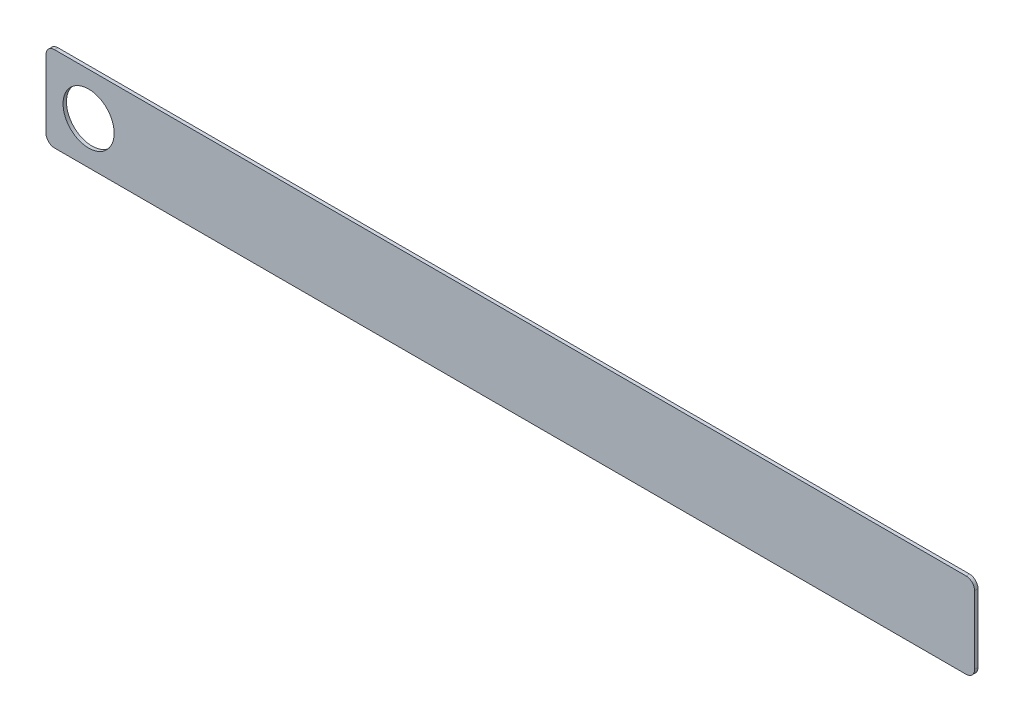
ISO-10303-21;
HEADER;
FILE_DESCRIPTION(('STEP AP214'),'2;1');
FILE_NAME('part.step','',(''),(''),'','','');
FILE_SCHEMA(('AUTOMOTIVE_DESIGN { 1 0 10303 214 1 1 1 1 }'));
ENDSEC;
DATA;
#1=APPLICATION_CONTEXT('core data for automotive mechanical design processes');
#2=APPLICATION_PROTOCOL_DEFINITION('international standard','automotive_design',2000,#1);
#3=PRODUCT_CONTEXT('',#1,'mechanical');
#4=PRODUCT('Part','Part','',(#3));
#5=PRODUCT_RELATED_PRODUCT_CATEGORY('part','',(#4));
#6=PRODUCT_DEFINITION_FORMATION('','',#4);
#7=PRODUCT_DEFINITION_CONTEXT('part definition',#1,'design');
#8=PRODUCT_DEFINITION('design','',#6,#7);
#9=PRODUCT_DEFINITION_SHAPE('','',#8);
#10=(LENGTH_UNIT() NAMED_UNIT(*) SI_UNIT(.MILLI.,.METRE.));
#11=(NAMED_UNIT(*) PLANE_ANGLE_UNIT() SI_UNIT($,.RADIAN.));
#12=(NAMED_UNIT(*) SI_UNIT($,.STERADIAN.) SOLID_ANGLE_UNIT());
#13=UNCERTAINTY_MEASURE_WITH_UNIT(LENGTH_MEASURE(1.E-05),#10,'distance_accuracy_value','');
#14=(GEOMETRIC_REPRESENTATION_CONTEXT(3) GLOBAL_UNCERTAINTY_ASSIGNED_CONTEXT((#13)) GLOBAL_UNIT_ASSIGNED_CONTEXT((#10,
#11,#12)) REPRESENTATION_CONTEXT('',''));
#15=CARTESIAN_POINT('',(0.,0.,0.));
#16=DIRECTION('',(0.,0.,1.));
#17=DIRECTION('',(1.,0.,0.));
#18=AXIS2_PLACEMENT_3D('',#15,#16,#17);
#19=CARTESIAN_POINT('',(18.9228917978101,1.4,0.17));
#20=DIRECTION('',(0.,0.,-1.));
#21=DIRECTION('',(-1.,0.,0.));
#22=AXIS2_PLACEMENT_3D('',#19,#20,#21);
#23=PLANE('',#22);
#24=CARTESIAN_POINT('',(18.9228917978101,1.4,0.17));
#25=DIRECTION('',(0.,0.,1.));
#26=DIRECTION('',(-1.,0.,0.));
#27=AXIS2_PLACEMENT_3D('',#24,#25,#26);
#28=CIRCLE('',#27,0.350000000000003);
#29=CARTESIAN_POINT('',(19.2728917978101,1.4,0.17));
#30=VERTEX_POINT('',#29);
#31=CARTESIAN_POINT('',(18.9228917978101,1.75,0.17));
#32=VERTEX_POINT('',#31);
#33=EDGE_CURVE('E154',#30,#32,#28,.T.);
#34=ORIENTED_EDGE('',*,*,#33,.T.);
#35=DIRECTION('',(-1.,0.,0.));
#36=VECTOR('',#35,1.);
#37=CARTESIAN_POINT('',(-18.5271082021899,1.75,0.17));
#38=LINE('',#37,#36);
#39=CARTESIAN_POINT('',(-18.5271082021899,1.75,0.17));
#40=VERTEX_POINT('',#39);
#41=EDGE_CURVE('E102',#32,#40,#38,.T.);
#42=ORIENTED_EDGE('',*,*,#41,.T.);
#43=CARTESIAN_POINT('',(-18.5271082021899,1.4,0.17));
#44=DIRECTION('',(0.,0.,1.));
#45=DIRECTION('',(1.,0.,0.));
#46=AXIS2_PLACEMENT_3D('',#43,#44,#45);
#47=CIRCLE('',#46,0.349999999999999);
#48=CARTESIAN_POINT('',(-18.8771082021899,1.4,0.17));
#49=VERTEX_POINT('',#48);
#50=EDGE_CURVE('E169',#40,#49,#47,.T.);
#51=ORIENTED_EDGE('',*,*,#50,.T.);
#52=DIRECTION('',(0.,-1.,0.));
#53=VECTOR('',#52,1.);
#54=CARTESIAN_POINT('',(-18.8771082021899,1.4,0.17));
#55=LINE('',#54,#53);
#56=CARTESIAN_POINT('',(-18.8771082021899,-1.4,0.17));
#57=VERTEX_POINT('',#56);
#58=EDGE_CURVE('E182',#49,#57,#55,.T.);
#59=ORIENTED_EDGE('',*,*,#58,.T.);
#60=CARTESIAN_POINT('',(-18.5271082021899,-1.4,0.17));
#61=DIRECTION('',(0.,0.,1.));
#62=DIRECTION('',(1.,0.,0.));
#63=AXIS2_PLACEMENT_3D('',#60,#61,#62);
#64=CIRCLE('',#63,0.349999999999999);
#65=CARTESIAN_POINT('',(-18.5271082021899,-1.75,0.17));
#66=VERTEX_POINT('',#65);
#67=EDGE_CURVE('E121',#57,#66,#64,.T.);
#68=ORIENTED_EDGE('',*,*,#67,.T.);
#69=DIRECTION('',(1.,0.,0.));
#70=VECTOR('',#69,1.);
#71=CARTESIAN_POINT('',(-18.5271082021899,-1.75,0.17));
#72=LINE('',#71,#70);
#73=CARTESIAN_POINT('',(18.9228917978101,-1.75,0.17));
#74=VERTEX_POINT('',#73);
#75=EDGE_CURVE('E115',#66,#74,#72,.T.);
#76=ORIENTED_EDGE('',*,*,#75,.T.);
#77=CARTESIAN_POINT('',(18.9228917978101,-1.4,0.17));
#78=DIRECTION('',(0.,0.,1.));
#79=DIRECTION('',(1.,0.,0.));
#80=AXIS2_PLACEMENT_3D('',#77,#78,#79);
#81=CIRCLE('',#80,0.350000000000003);
#82=CARTESIAN_POINT('',(19.2728917978101,-1.4,0.17));
#83=VERTEX_POINT('',#82);
#84=EDGE_CURVE('E119',#74,#83,#81,.T.);
#85=ORIENTED_EDGE('',*,*,#84,.T.);
#86=DIRECTION('',(0.,1.,0.));
#87=VECTOR('',#86,1.);
#88=CARTESIAN_POINT('',(19.2728917978101,1.4,0.17));
#89=LINE('',#88,#87);
#90=EDGE_CURVE('E59',#83,#30,#89,.T.);
#91=ORIENTED_EDGE('',*,*,#90,.T.);
#92=EDGE_LOOP('',(#34,#42,#51,#59,#68,#76,#85,#91));
#93=FACE_BOUND('',#92,.T.);
#94=CARTESIAN_POINT('',(-17.1271082021899,0.,0.17));
#95=DIRECTION('',(0.,0.,1.));
#96=DIRECTION('',(1.,0.,0.));
#97=AXIS2_PLACEMENT_3D('',#94,#95,#96);
#98=CIRCLE('',#97,1.05);
#99=CARTESIAN_POINT('',(-16.0771082021899,0.,0.17));
#100=VERTEX_POINT('',#99);
#101=EDGE_CURVE('E143',#100,#100,#98,.T.);
#102=ORIENTED_EDGE('',*,*,#101,.F.);
#103=EDGE_LOOP('',(#102));
#104=FACE_BOUND('',#103,.T.);
#105=ADVANCED_FACE('F42',(#93,#104),#23,.F.);
#106=CARTESIAN_POINT('',(18.9228917978101,1.4,0.03));
#107=DIRECTION('',(0.,0.,-1.));
#108=DIRECTION('',(-1.,0.,0.));
#109=AXIS2_PLACEMENT_3D('',#106,#107,#108);
#110=PLANE('',#109);
#111=CARTESIAN_POINT('',(18.9228917978101,1.4,0.03));
#112=DIRECTION('',(0.,0.,1.));
#113=DIRECTION('',(-1.,0.,0.));
#114=AXIS2_PLACEMENT_3D('',#111,#112,#113);
#115=CIRCLE('',#114,0.350000000000003);
#116=CARTESIAN_POINT('',(19.2728917978101,1.4,0.03));
#117=VERTEX_POINT('',#116);
#118=CARTESIAN_POINT('',(18.9228917978101,1.75,0.03));
#119=VERTEX_POINT('',#118);
#120=EDGE_CURVE('E139',#117,#119,#115,.T.);
#121=ORIENTED_EDGE('',*,*,#120,.F.);
#122=DIRECTION('',(0.,1.,0.));
#123=VECTOR('',#122,1.);
#124=CARTESIAN_POINT('',(19.2728917978101,1.4,0.03));
#125=LINE('',#124,#123);
#126=CARTESIAN_POINT('',(19.2728917978101,-1.4,0.03));
#127=VERTEX_POINT('',#126);
#128=EDGE_CURVE('E94',#127,#117,#125,.T.);
#129=ORIENTED_EDGE('',*,*,#128,.F.);
#130=CARTESIAN_POINT('',(18.9228917978101,-1.4,0.03));
#131=DIRECTION('',(0.,0.,1.));
#132=DIRECTION('',(1.,0.,0.));
#133=AXIS2_PLACEMENT_3D('',#130,#131,#132);
#134=CIRCLE('',#133,0.350000000000003);
#135=CARTESIAN_POINT('',(18.9228917978101,-1.75,0.03));
#136=VERTEX_POINT('',#135);
#137=EDGE_CURVE('E88',#136,#127,#134,.T.);
#138=ORIENTED_EDGE('',*,*,#137,.F.);
#139=DIRECTION('',(1.,0.,0.));
#140=VECTOR('',#139,1.);
#141=CARTESIAN_POINT('',(-18.5271082021899,-1.75,0.03));
#142=LINE('',#141,#140);
#143=CARTESIAN_POINT('',(-18.5271082021899,-1.75,0.03));
#144=VERTEX_POINT('',#143);
#145=EDGE_CURVE('E129',#144,#136,#142,.T.);
#146=ORIENTED_EDGE('',*,*,#145,.F.);
#147=CARTESIAN_POINT('',(-18.5271082021899,-1.4,0.03));
#148=DIRECTION('',(0.,0.,1.));
#149=DIRECTION('',(1.,0.,0.));
#150=AXIS2_PLACEMENT_3D('',#147,#148,#149);
#151=CIRCLE('',#150,0.349999999999999);
#152=CARTESIAN_POINT('',(-18.8771082021899,-1.4,0.03));
#153=VERTEX_POINT('',#152);
#154=EDGE_CURVE('E149',#153,#144,#151,.T.);
#155=ORIENTED_EDGE('',*,*,#154,.F.);
#156=DIRECTION('',(0.,-1.,0.));
#157=VECTOR('',#156,1.);
#158=CARTESIAN_POINT('',(-18.8771082021899,1.4,0.03));
#159=LINE('',#158,#157);
#160=CARTESIAN_POINT('',(-18.8771082021899,1.4,0.03));
#161=VERTEX_POINT('',#160);
#162=EDGE_CURVE('E147',#161,#153,#159,.T.);
#163=ORIENTED_EDGE('',*,*,#162,.F.);
#164=CARTESIAN_POINT('',(-18.5271082021899,1.4,0.03));
#165=DIRECTION('',(0.,0.,1.));
#166=DIRECTION('',(1.,0.,0.));
#167=AXIS2_PLACEMENT_3D('',#164,#165,#166);
#168=CIRCLE('',#167,0.349999999999999);
#169=CARTESIAN_POINT('',(-18.5271082021899,1.75,0.03));
#170=VERTEX_POINT('',#169);
#171=EDGE_CURVE('E145',#170,#161,#168,.T.);
#172=ORIENTED_EDGE('',*,*,#171,.F.);
#173=DIRECTION('',(-1.,0.,0.));
#174=VECTOR('',#173,1.);
#175=CARTESIAN_POINT('',(-18.5271082021899,1.75,0.03));
#176=LINE('',#175,#174);
#177=EDGE_CURVE('E142',#119,#170,#176,.T.);
#178=ORIENTED_EDGE('',*,*,#177,.F.);
#179=EDGE_LOOP('',(#121,#129,#138,#146,#155,#163,#172,#178));
#180=FACE_BOUND('',#179,.T.);
#181=CARTESIAN_POINT('',(-17.1271082021899,0.,0.03));
#182=DIRECTION('',(0.,0.,1.));
#183=DIRECTION('',(1.,0.,0.));
#184=AXIS2_PLACEMENT_3D('',#181,#182,#183);
#185=CIRCLE('',#184,1.05);
#186=CARTESIAN_POINT('',(-16.0771082021899,0.,0.03));
#187=VERTEX_POINT('',#186);
#188=EDGE_CURVE('E188',#187,#187,#185,.T.);
#189=ORIENTED_EDGE('',*,*,#188,.T.);
#190=EDGE_LOOP('',(#189));
#191=FACE_BOUND('',#190,.T.);
#192=ADVANCED_FACE('F173',(#180,#191),#110,.T.);
#193=CARTESIAN_POINT('',(18.9228917978101,1.4,0.17));
#194=DIRECTION('',(0.,0.,-1.));
#195=DIRECTION('',(-1.,0.,0.));
#196=AXIS2_PLACEMENT_3D('',#193,#194,#195);
#197=CYLINDRICAL_SURFACE('',#196,0.350000000000003);
#198=ORIENTED_EDGE('',*,*,#120,.T.);
#199=DIRECTION('',(0.,0.,-1.));
#200=VECTOR('',#199,1.);
#201=CARTESIAN_POINT('',(18.9228917978101,1.75,0.17));
#202=LINE('',#201,#200);
#203=EDGE_CURVE('E12',#32,#119,#202,.T.);
#204=ORIENTED_EDGE('',*,*,#203,.F.);
#205=ORIENTED_EDGE('',*,*,#33,.F.);
#206=DIRECTION('',(0.,0.,-1.));
#207=VECTOR('',#206,1.);
#208=CARTESIAN_POINT('',(19.2728917978101,1.4,0.17));
#209=LINE('',#208,#207);
#210=EDGE_CURVE('E135',#30,#117,#209,.T.);
#211=ORIENTED_EDGE('',*,*,#210,.T.);
#212=EDGE_LOOP('',(#198,#204,#205,#211));
#213=FACE_BOUND('',#212,.T.);
#214=ADVANCED_FACE('F44',(#213),#197,.T.);
#215=CARTESIAN_POINT('',(-18.5271082021899,1.75,0.17));
#216=DIRECTION('',(0.,-1.,0.));
#217=DIRECTION('',(0.,0.,-1.));
#218=AXIS2_PLACEMENT_3D('',#215,#216,#217);
#219=PLANE('',#218);
#220=ORIENTED_EDGE('',*,*,#177,.T.);
#221=DIRECTION('',(0.,0.,-1.));
#222=VECTOR('',#221,1.);
#223=CARTESIAN_POINT('',(-18.5271082021899,1.75,0.17));
#224=LINE('',#223,#222);
#225=EDGE_CURVE('E51',#40,#170,#224,.T.);
#226=ORIENTED_EDGE('',*,*,#225,.F.);
#227=ORIENTED_EDGE('',*,*,#41,.F.);
#228=ORIENTED_EDGE('',*,*,#203,.T.);
#229=EDGE_LOOP('',(#220,#226,#227,#228));
#230=FACE_BOUND('',#229,.T.);
#231=ADVANCED_FACE('F216',(#230),#219,.F.);
#232=CARTESIAN_POINT('',(-18.5271082021899,1.4,0.17));
#233=DIRECTION('',(0.,0.,-1.));
#234=DIRECTION('',(-1.,0.,0.));
#235=AXIS2_PLACEMENT_3D('',#232,#233,#234);
#236=CYLINDRICAL_SURFACE('',#235,0.349999999999999);
#237=ORIENTED_EDGE('',*,*,#171,.T.);
#238=DIRECTION('',(0.,0.,-1.));
#239=VECTOR('',#238,1.);
#240=CARTESIAN_POINT('',(-18.8771082021899,1.4,0.17));
#241=LINE('',#240,#239);
#242=EDGE_CURVE('E161',#49,#161,#241,.T.);
#243=ORIENTED_EDGE('',*,*,#242,.F.);
#244=ORIENTED_EDGE('',*,*,#50,.F.);
#245=ORIENTED_EDGE('',*,*,#225,.T.);
#246=EDGE_LOOP('',(#237,#243,#244,#245));
#247=FACE_BOUND('',#246,.T.);
#248=ADVANCED_FACE('F167',(#247),#236,.T.);
#249=CARTESIAN_POINT('',(-18.8771082021899,1.4,0.17));
#250=DIRECTION('',(1.,0.,0.));
#251=DIRECTION('',(0.,0.,-1.));
#252=AXIS2_PLACEMENT_3D('',#249,#250,#251);
#253=PLANE('',#252);
#254=ORIENTED_EDGE('',*,*,#162,.T.);
#255=DIRECTION('',(0.,0.,-1.));
#256=VECTOR('',#255,1.);
#257=CARTESIAN_POINT('',(-18.8771082021899,-1.4,0.17));
#258=LINE('',#257,#256);
#259=EDGE_CURVE('E158',#57,#153,#258,.T.);
#260=ORIENTED_EDGE('',*,*,#259,.F.);
#261=ORIENTED_EDGE('',*,*,#58,.F.);
#262=ORIENTED_EDGE('',*,*,#242,.T.);
#263=EDGE_LOOP('',(#254,#260,#261,#262));
#264=FACE_BOUND('',#263,.T.);
#265=ADVANCED_FACE('F178',(#264),#253,.F.);
#266=CARTESIAN_POINT('',(-18.5271082021899,-1.4,0.17));
#267=DIRECTION('',(0.,0.,-1.));
#268=DIRECTION('',(-1.,0.,0.));
#269=AXIS2_PLACEMENT_3D('',#266,#267,#268);
#270=CYLINDRICAL_SURFACE('',#269,0.349999999999999);
#271=ORIENTED_EDGE('',*,*,#154,.T.);
#272=DIRECTION('',(0.,0.,-1.));
#273=VECTOR('',#272,1.);
#274=CARTESIAN_POINT('',(-18.5271082021899,-1.75,0.17));
#275=LINE('',#274,#273);
#276=EDGE_CURVE('E130',#66,#144,#275,.T.);
#277=ORIENTED_EDGE('',*,*,#276,.F.);
#278=ORIENTED_EDGE('',*,*,#67,.F.);
#279=ORIENTED_EDGE('',*,*,#259,.T.);
#280=EDGE_LOOP('',(#271,#277,#278,#279));
#281=FACE_BOUND('',#280,.T.);
#282=ADVANCED_FACE('F181',(#281),#270,.T.);
#283=CARTESIAN_POINT('',(-18.5271082021899,-1.75,0.17));
#284=DIRECTION('',(0.,1.,0.));
#285=DIRECTION('',(0.,0.,1.));
#286=AXIS2_PLACEMENT_3D('',#283,#284,#285);
#287=PLANE('',#286);
#288=ORIENTED_EDGE('',*,*,#145,.T.);
#289=DIRECTION('',(0.,0.,-1.));
#290=VECTOR('',#289,1.);
#291=CARTESIAN_POINT('',(18.9228917978101,-1.75,0.17));
#292=LINE('',#291,#290);
#293=EDGE_CURVE('E126',#74,#136,#292,.T.);
#294=ORIENTED_EDGE('',*,*,#293,.F.);
#295=ORIENTED_EDGE('',*,*,#75,.F.);
#296=ORIENTED_EDGE('',*,*,#276,.T.);
#297=EDGE_LOOP('',(#288,#294,#295,#296));
#298=FACE_BOUND('',#297,.T.);
#299=ADVANCED_FACE('F127',(#298),#287,.F.);
#300=CARTESIAN_POINT('',(18.9228917978101,-1.4,0.17));
#301=DIRECTION('',(0.,0.,-1.));
#302=DIRECTION('',(-1.,0.,0.));
#303=AXIS2_PLACEMENT_3D('',#300,#301,#302);
#304=CYLINDRICAL_SURFACE('',#303,0.350000000000003);
#305=ORIENTED_EDGE('',*,*,#137,.T.);
#306=DIRECTION('',(0.,0.,-1.));
#307=VECTOR('',#306,1.);
#308=CARTESIAN_POINT('',(19.2728917978101,-1.4,0.17));
#309=LINE('',#308,#307);
#310=EDGE_CURVE('E131',#83,#127,#309,.T.);
#311=ORIENTED_EDGE('',*,*,#310,.F.);
#312=ORIENTED_EDGE('',*,*,#84,.F.);
#313=ORIENTED_EDGE('',*,*,#293,.T.);
#314=EDGE_LOOP('',(#305,#311,#312,#313));
#315=FACE_BOUND('',#314,.T.);
#316=ADVANCED_FACE('F133',(#315),#304,.T.);
#317=CARTESIAN_POINT('',(19.2728917978101,1.4,0.17));
#318=DIRECTION('',(-1.,0.,0.));
#319=DIRECTION('',(0.,0.,1.));
#320=AXIS2_PLACEMENT_3D('',#317,#318,#319);
#321=PLANE('',#320);
#322=ORIENTED_EDGE('',*,*,#128,.T.);
#323=ORIENTED_EDGE('',*,*,#210,.F.);
#324=ORIENTED_EDGE('',*,*,#90,.F.);
#325=ORIENTED_EDGE('',*,*,#310,.T.);
#326=EDGE_LOOP('',(#322,#323,#324,#325));
#327=FACE_BOUND('',#326,.T.);
#328=ADVANCED_FACE('F204',(#327),#321,.F.);
#329=CARTESIAN_POINT('',(-17.1271082021899,0.,0.17));
#330=DIRECTION('',(0.,0.,-1.));
#331=DIRECTION('',(-1.,0.,0.));
#332=AXIS2_PLACEMENT_3D('',#329,#330,#331);
#333=CYLINDRICAL_SURFACE('',#332,1.05);
#334=ORIENTED_EDGE('',*,*,#101,.T.);
#335=EDGE_LOOP('',(#334));
#336=FACE_BOUND('',#335,.T.);
#337=ORIENTED_EDGE('',*,*,#188,.F.);
#338=EDGE_LOOP('',(#337));
#339=FACE_BOUND('',#338,.T.);
#340=ADVANCED_FACE('F194',(#336,#339),#333,.F.);
#341=CLOSED_SHELL('',(#105,#192,#214,#231,#248,#265,#282,#299,#316,#328,#340));
#342=MANIFOLD_SOLID_BREP('B2',#341);
#343=ADVANCED_BREP_SHAPE_REPRESENTATION('',(#18,#342),#14);
#344=SHAPE_DEFINITION_REPRESENTATION(#9,#343);
ENDSEC;
END-ISO-10303-21;
